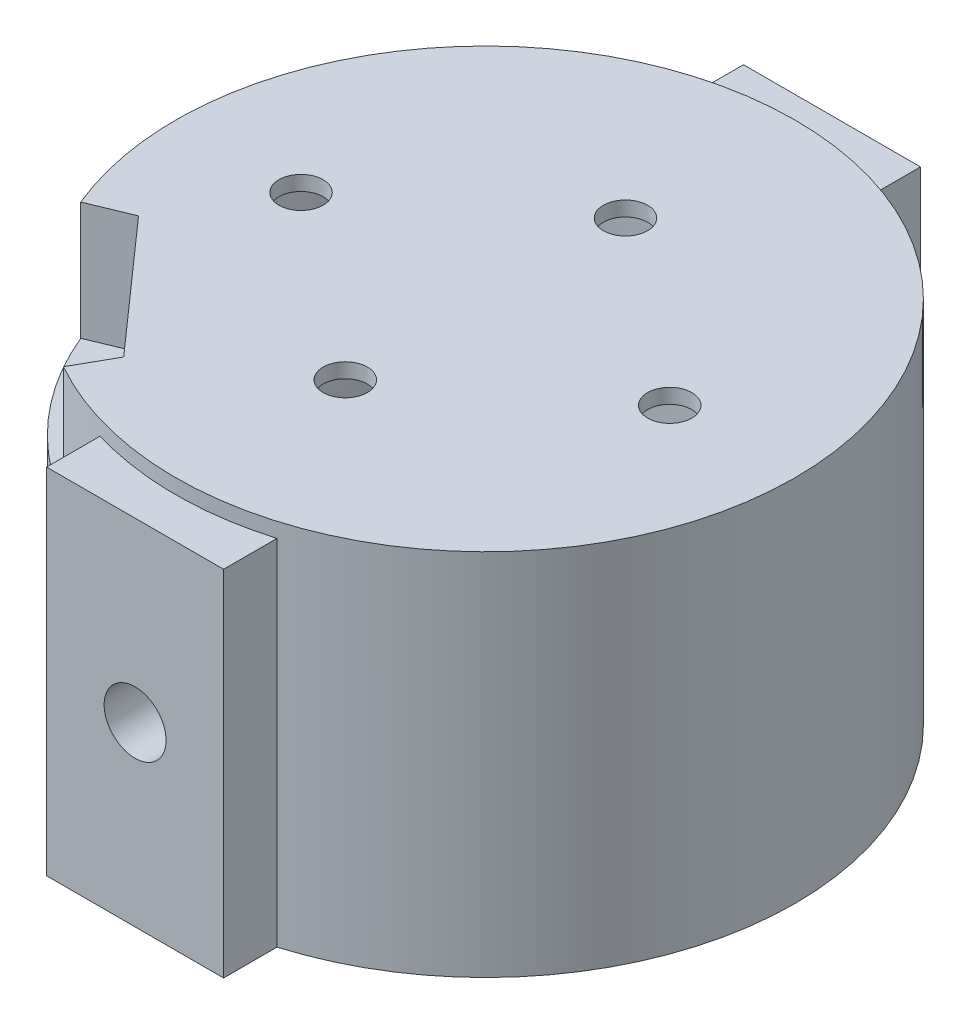
ISO-10303-21;
HEADER;
FILE_DESCRIPTION(('STEP AP214'),'2;1');
FILE_NAME('part.step','',(''),(''),'','','');
FILE_SCHEMA(('AUTOMOTIVE_DESIGN { 1 0 10303 214 1 1 1 1 }'));
ENDSEC;
DATA;
#1=APPLICATION_CONTEXT('core data for automotive mechanical design processes');
#2=APPLICATION_PROTOCOL_DEFINITION('international standard','automotive_design',2000,#1);
#3=PRODUCT_CONTEXT('',#1,'mechanical');
#4=PRODUCT('Part','Part','',(#3));
#5=PRODUCT_RELATED_PRODUCT_CATEGORY('part','',(#4));
#6=PRODUCT_DEFINITION_FORMATION('','',#4);
#7=PRODUCT_DEFINITION_CONTEXT('part definition',#1,'design');
#8=PRODUCT_DEFINITION('design','',#6,#7);
#9=PRODUCT_DEFINITION_SHAPE('','',#8);
#10=(LENGTH_UNIT() NAMED_UNIT(*) SI_UNIT(.MILLI.,.METRE.));
#11=(NAMED_UNIT(*) PLANE_ANGLE_UNIT() SI_UNIT($,.RADIAN.));
#12=(NAMED_UNIT(*) SI_UNIT($,.STERADIAN.) SOLID_ANGLE_UNIT());
#13=UNCERTAINTY_MEASURE_WITH_UNIT(LENGTH_MEASURE(1.E-05),#10,'distance_accuracy_value','');
#14=(GEOMETRIC_REPRESENTATION_CONTEXT(3) GLOBAL_UNCERTAINTY_ASSIGNED_CONTEXT((#13)) GLOBAL_UNIT_ASSIGNED_CONTEXT((#10,
#11,#12)) REPRESENTATION_CONTEXT('',''));
#15=CARTESIAN_POINT('',(0.,0.,0.));
#16=DIRECTION('',(0.,0.,1.));
#17=DIRECTION('',(1.,0.,0.));
#18=AXIS2_PLACEMENT_3D('',#15,#16,#17);
#19=CARTESIAN_POINT('',(0.,12.,0.));
#20=DIRECTION('',(0.,1.,0.));
#21=DIRECTION('',(0.,0.,1.));
#22=AXIS2_PLACEMENT_3D('',#19,#20,#21);
#23=PLANE('',#22);
#24=CARTESIAN_POINT('',(12.5,12.,0.));
#25=DIRECTION('',(0.,1.,0.));
#26=DIRECTION('',(0.,0.,1.));
#27=AXIS2_PLACEMENT_3D('',#24,#25,#26);
#28=CIRCLE('',#27,1.5);
#29=CARTESIAN_POINT('',(12.5,12.,1.5));
#30=VERTEX_POINT('',#29);
#31=EDGE_CURVE('E443',#30,#30,#28,.F.);
#32=ORIENTED_EDGE('',*,*,#31,.F.);
#33=EDGE_LOOP('',(#32));
#34=FACE_BOUND('',#33,.T.);
#35=CARTESIAN_POINT('',(-12.5,12.,0.));
#36=DIRECTION('',(0.,1.,0.));
#37=DIRECTION('',(0.,0.,1.));
#38=AXIS2_PLACEMENT_3D('',#35,#36,#37);
#39=CIRCLE('',#38,1.5);
#40=CARTESIAN_POINT('',(-12.5,12.,1.5));
#41=VERTEX_POINT('',#40);
#42=EDGE_CURVE('E461',#41,#41,#39,.F.);
#43=ORIENTED_EDGE('',*,*,#42,.F.);
#44=EDGE_LOOP('',(#43));
#45=FACE_BOUND('',#44,.T.);
#46=CARTESIAN_POINT('',(0.,12.,9.5));
#47=DIRECTION('',(0.,1.,0.));
#48=DIRECTION('',(0.,0.,1.));
#49=AXIS2_PLACEMENT_3D('',#46,#47,#48);
#50=CIRCLE('',#49,1.5);
#51=CARTESIAN_POINT('',(0.,12.,11.));
#52=VERTEX_POINT('',#51);
#53=EDGE_CURVE('E453',#52,#52,#50,.F.);
#54=ORIENTED_EDGE('',*,*,#53,.F.);
#55=EDGE_LOOP('',(#54));
#56=FACE_BOUND('',#55,.T.);
#57=CARTESIAN_POINT('',(0.,12.,-9.5));
#58=DIRECTION('',(0.,1.,0.));
#59=DIRECTION('',(0.,0.,1.));
#60=AXIS2_PLACEMENT_3D('',#57,#58,#59);
#61=CIRCLE('',#60,1.5);
#62=CARTESIAN_POINT('',(0.,12.,-8.));
#63=VERTEX_POINT('',#62);
#64=EDGE_CURVE('E448',#63,#63,#61,.F.);
#65=ORIENTED_EDGE('',*,*,#64,.F.);
#66=EDGE_LOOP('',(#65));
#67=FACE_BOUND('',#66,.T.);
#68=DIRECTION('',(0.662867909724428,0.,0.748736358311501));
#69=VECTOR('',#68,1.);
#70=CARTESIAN_POINT('',(-12.7403267092854,12.,11.2792088179547));
#71=LINE('',#70,#69);
#72=CARTESIAN_POINT('',(-16.08935317476,12.,7.49634673810121));
#73=VERTEX_POINT('',#72);
#74=CARTESIAN_POINT('',(-9.39130024381087,12.,15.0620708978081));
#75=VERTEX_POINT('',#74);
#76=EDGE_CURVE('E171',#73,#75,#71,.T.);
#77=ORIENTED_EDGE('',*,*,#76,.F.);
#78=CARTESIAN_POINT('',(0.,12.,0.));
#79=DIRECTION('',(0.,1.,0.));
#80=DIRECTION('',(0.,0.,1.));
#81=AXIS2_PLACEMENT_3D('',#78,#79,#80);
#82=CIRCLE('',#81,17.75);
#83=CARTESIAN_POINT('',(-2.9685855217595,12.,-17.5));
#84=VERTEX_POINT('',#83);
#85=EDGE_CURVE('E260',#84,#73,#82,.T.);
#86=ORIENTED_EDGE('',*,*,#85,.F.);
#87=DIRECTION('',(1.,0.,0.));
#88=VECTOR('',#87,1.);
#89=CARTESIAN_POINT('',(-6.,12.,-17.5));
#90=LINE('',#89,#88);
#91=CARTESIAN_POINT('',(2.9685855217595,12.,-17.5));
#92=VERTEX_POINT('',#91);
#93=EDGE_CURVE('E215',#84,#92,#90,.T.);
#94=ORIENTED_EDGE('',*,*,#93,.T.);
#95=EDGE_CURVE('E252',#75,#92,#82,.T.);
#96=ORIENTED_EDGE('',*,*,#95,.F.);
#97=EDGE_LOOP('',(#77,#86,#94,#96));
#98=FACE_BOUND('',#97,.T.);
#99=ADVANCED_FACE('F45',(#34,#45,#56,#67,#98),#23,.F.);
#100=CARTESIAN_POINT('',(0.,13.,0.));
#101=DIRECTION('',(0.,-1.,0.));
#102=DIRECTION('',(0.,0.,-1.));
#103=AXIS2_PLACEMENT_3D('',#100,#101,#102);
#104=CYLINDRICAL_SURFACE('',#103,21.);
#105=CARTESIAN_POINT('',(0.,12.,0.));
#106=DIRECTION('',(0.,1.,0.));
#107=DIRECTION('',(0.,0.,1.));
#108=AXIS2_PLACEMENT_3D('',#105,#106,#107);
#109=CIRCLE('',#108,21.);
#110=CARTESIAN_POINT('',(6.,12.,-20.1246117974981));
#111=VERTEX_POINT('',#110);
#112=CARTESIAN_POINT('',(-6.,12.,-20.1246117974981));
#113=VERTEX_POINT('',#112);
#114=EDGE_CURVE('E190',#111,#113,#109,.T.);
#115=ORIENTED_EDGE('',*,*,#114,.T.);
#116=DIRECTION('',(0.,-1.,0.));
#117=VECTOR('',#116,1.);
#118=CARTESIAN_POINT('',(-6.,12.,-20.1246117974981));
#119=LINE('',#118,#117);
#120=CARTESIAN_POINT('',(-6.,-12.,-20.1246117974981));
#121=VERTEX_POINT('',#120);
#122=EDGE_CURVE('E289',#113,#121,#119,.T.);
#123=ORIENTED_EDGE('',*,*,#122,.T.);
#124=CARTESIAN_POINT('',(0.,-12.,0.));
#125=DIRECTION('',(0.,1.,0.));
#126=DIRECTION('',(0.,0.,1.));
#127=AXIS2_PLACEMENT_3D('',#124,#125,#126);
#128=CIRCLE('',#127,21.);
#129=CARTESIAN_POINT('',(-6.,-12.,20.1246117974981));
#130=VERTEX_POINT('',#129);
#131=EDGE_CURVE('E265',#121,#130,#128,.T.);
#132=ORIENTED_EDGE('',*,*,#131,.T.);
#133=DIRECTION('',(0.,-1.,0.));
#134=VECTOR('',#133,1.);
#135=CARTESIAN_POINT('',(-6.,12.,20.1246117974981));
#136=LINE('',#135,#134);
#137=CARTESIAN_POINT('',(-6.,12.,20.1246117974981));
#138=VERTEX_POINT('',#137);
#139=EDGE_CURVE('E275',#138,#130,#136,.T.);
#140=ORIENTED_EDGE('',*,*,#139,.F.);
#141=CARTESIAN_POINT('',(6.,12.,20.1246117974981));
#142=VERTEX_POINT('',#141);
#143=EDGE_CURVE('E198',#138,#142,#109,.T.);
#144=ORIENTED_EDGE('',*,*,#143,.T.);
#145=DIRECTION('',(0.,-1.,0.));
#146=VECTOR('',#145,1.);
#147=CARTESIAN_POINT('',(6.,12.,20.1246117974981));
#148=LINE('',#147,#146);
#149=CARTESIAN_POINT('',(6.,-12.,20.1246117974981));
#150=VERTEX_POINT('',#149);
#151=EDGE_CURVE('E279',#150,#142,#148,.F.);
#152=ORIENTED_EDGE('',*,*,#151,.F.);
#153=CARTESIAN_POINT('',(6.,-12.,-20.1246117974981));
#154=VERTEX_POINT('',#153);
#155=EDGE_CURVE('E272',#150,#154,#128,.T.);
#156=ORIENTED_EDGE('',*,*,#155,.T.);
#157=DIRECTION('',(0.,-1.,0.));
#158=VECTOR('',#157,1.);
#159=CARTESIAN_POINT('',(6.,12.,-20.1246117974981));
#160=LINE('',#159,#158);
#161=EDGE_CURVE('E201',#154,#111,#160,.F.);
#162=ORIENTED_EDGE('',*,*,#161,.T.);
#163=EDGE_LOOP('',(#115,#123,#132,#140,#144,#152,#156,#162));
#164=FACE_BOUND('',#163,.T.);
#165=DIRECTION('',(0.,-1.,0.));
#166=VECTOR('',#165,1.);
#167=CARTESIAN_POINT('',(-10.3237377867659,13.,18.2871659398088));
#168=LINE('',#167,#166);
#169=CARTESIAN_POINT('',(-10.3237377867659,13.,18.2871659398088));
#170=VERTEX_POINT('',#169);
#171=CARTESIAN_POINT('',(-10.3237377867659,5.,18.2871659398088));
#172=VERTEX_POINT('',#171);
#173=EDGE_CURVE('E159',#170,#172,#168,.T.);
#174=ORIENTED_EDGE('',*,*,#173,.T.);
#175=CARTESIAN_POINT('',(0.,5.,0.));
#176=DIRECTION('',(0.,1.,0.));
#177=DIRECTION('',(0.,0.,1.));
#178=AXIS2_PLACEMENT_3D('',#175,#176,#177);
#179=CIRCLE('',#178,21.);
#180=CARTESIAN_POINT('',(-19.4036912015668,5.,8.03098796875209));
#181=VERTEX_POINT('',#180);
#182=EDGE_CURVE('E428',#181,#172,#179,.T.);
#183=ORIENTED_EDGE('',*,*,#182,.F.);
#184=DIRECTION('',(0.,-1.,0.));
#185=VECTOR('',#184,1.);
#186=CARTESIAN_POINT('',(-19.4036912015668,13.,8.03098796875209));
#187=LINE('',#186,#185);
#188=CARTESIAN_POINT('',(-19.4036912015668,13.,8.03098796875209));
#189=VERTEX_POINT('',#188);
#190=EDGE_CURVE('E187',#189,#181,#187,.T.);
#191=ORIENTED_EDGE('',*,*,#190,.F.);
#192=CARTESIAN_POINT('',(0.,13.,0.));
#193=DIRECTION('',(0.,1.,0.));
#194=DIRECTION('',(0.,0.,1.));
#195=AXIS2_PLACEMENT_3D('',#192,#193,#194);
#196=CIRCLE('',#195,21.);
#197=EDGE_CURVE('E179',#170,#189,#196,.T.);
#198=ORIENTED_EDGE('',*,*,#197,.F.);
#199=EDGE_LOOP('',(#174,#183,#191,#198));
#200=FACE_BOUND('',#199,.T.);
#201=ADVANCED_FACE('F185',(#164,#200),#104,.T.);
#202=CARTESIAN_POINT('',(0.,13.,0.));
#203=DIRECTION('',(0.,1.,0.));
#204=DIRECTION('',(0.,0.,1.));
#205=AXIS2_PLACEMENT_3D('',#202,#203,#204);
#206=PLANE('',#205);
#207=CARTESIAN_POINT('',(0.,13.,-9.5));
#208=DIRECTION('',(0.,1.,0.));
#209=DIRECTION('',(0.,0.,1.));
#210=AXIS2_PLACEMENT_3D('',#207,#208,#209);
#211=CIRCLE('',#210,1.5);
#212=CARTESIAN_POINT('',(0.,13.,-8.));
#213=VERTEX_POINT('',#212);
#214=EDGE_CURVE('E444',#213,#213,#211,.T.);
#215=ORIENTED_EDGE('',*,*,#214,.F.);
#216=EDGE_LOOP('',(#215));
#217=FACE_BOUND('',#216,.T.);
#218=CARTESIAN_POINT('',(0.,13.,9.5));
#219=DIRECTION('',(0.,1.,0.));
#220=DIRECTION('',(0.,0.,1.));
#221=AXIS2_PLACEMENT_3D('',#218,#219,#220);
#222=CIRCLE('',#221,1.5);
#223=CARTESIAN_POINT('',(0.,13.,11.));
#224=VERTEX_POINT('',#223);
#225=EDGE_CURVE('E449',#224,#224,#222,.T.);
#226=ORIENTED_EDGE('',*,*,#225,.F.);
#227=EDGE_LOOP('',(#226));
#228=FACE_BOUND('',#227,.T.);
#229=CARTESIAN_POINT('',(-12.5,13.,0.));
#230=DIRECTION('',(0.,1.,0.));
#231=DIRECTION('',(0.,0.,1.));
#232=AXIS2_PLACEMENT_3D('',#229,#230,#231);
#233=CIRCLE('',#232,1.5);
#234=CARTESIAN_POINT('',(-12.5,13.,1.5));
#235=VERTEX_POINT('',#234);
#236=EDGE_CURVE('E457',#235,#235,#233,.T.);
#237=ORIENTED_EDGE('',*,*,#236,.F.);
#238=EDGE_LOOP('',(#237));
#239=FACE_BOUND('',#238,.T.);
#240=CARTESIAN_POINT('',(12.5,13.,0.));
#241=DIRECTION('',(0.,1.,0.));
#242=DIRECTION('',(0.,0.,1.));
#243=AXIS2_PLACEMENT_3D('',#240,#241,#242);
#244=CIRCLE('',#243,1.5);
#245=CARTESIAN_POINT('',(12.5,13.,1.5));
#246=VERTEX_POINT('',#245);
#247=EDGE_CURVE('E465',#246,#246,#244,.T.);
#248=ORIENTED_EDGE('',*,*,#247,.F.);
#249=EDGE_LOOP('',(#248));
#250=FACE_BOUND('',#249,.T.);
#251=DIRECTION('',(-0.662867909724428,0.,-0.748736358311501));
#252=VECTOR('',#251,1.);
#253=CARTESIAN_POINT('',(-8.84891810294221,13.,15.6747136626932));
#254=LINE('',#253,#252);
#255=CARTESIAN_POINT('',(-8.84891810294221,13.,15.6747136626932));
#256=VERTEX_POINT('',#255);
#257=CARTESIAN_POINT('',(-16.6317353156287,13.,6.88370397321607));
#258=VERTEX_POINT('',#257);
#259=EDGE_CURVE('E180',#256,#258,#254,.T.);
#260=ORIENTED_EDGE('',*,*,#259,.F.);
#261=DIRECTION('',(0.491606561274567,0.,-0.870817425705179));
#262=VECTOR('',#261,1.);
#263=CARTESIAN_POINT('',(-10.3237377867659,13.,18.2871659398088));
#264=LINE('',#263,#262);
#265=EDGE_CURVE('E163',#170,#256,#264,.T.);
#266=ORIENTED_EDGE('',*,*,#265,.F.);
#267=ORIENTED_EDGE('',*,*,#197,.T.);
#268=DIRECTION('',(-0.923985295312703,0.,0.382427998512004));
#269=VECTOR('',#268,1.);
#270=CARTESIAN_POINT('',(-19.4036912015668,13.,8.03098796875209));
#271=LINE('',#270,#269);
#272=EDGE_CURVE('E436',#258,#189,#271,.T.);
#273=ORIENTED_EDGE('',*,*,#272,.F.);
#274=EDGE_LOOP('',(#260,#266,#267,#273));
#275=FACE_BOUND('',#274,.T.);
#276=ADVANCED_FACE('F177',(#217,#228,#239,#250,#275),#206,.T.);
#277=CARTESIAN_POINT('',(0.,12.,0.));
#278=DIRECTION('',(0.,-1.,0.));
#279=DIRECTION('',(0.,0.,-1.));
#280=AXIS2_PLACEMENT_3D('',#277,#278,#279);
#281=CYLINDRICAL_SURFACE('',#280,17.75);
#282=CARTESIAN_POINT('',(-2.1,0.,17.6253368762132));
#283=CARTESIAN_POINT('',(-2.09999497457011,0.117514192864876,17.6253384839931));
#284=CARTESIAN_POINT('',(-2.09010274397484,0.235103065271353,17.626524820879));
#285=CARTESIAN_POINT('',(-2.05079506603811,0.467011863027573,17.6311405220114));
#286=CARTESIAN_POINT('',(-2.02135889541085,0.581328183991729,17.6345722671053));
#287=CARTESIAN_POINT('',(-1.94384016752987,0.803300431820883,17.6432847596922));
#288=CARTESIAN_POINT('',(-1.89576987451454,0.91096068551862,17.6485642908245));
#289=CARTESIAN_POINT('',(-1.78237295939766,1.11666484517722,17.66037601189));
#290=CARTESIAN_POINT('',(-1.71704942477816,1.21471046738401,17.6669079776417));
#291=CARTESIAN_POINT('',(-1.57064819362347,1.39891625415866,17.6805253710103));
#292=CARTESIAN_POINT('',(-1.48950112066302,1.4850211124615,17.6876131505886));
#293=CARTESIAN_POINT('',(-1.31390539278136,1.64242383836488,17.7015223563675));
#294=CARTESIAN_POINT('',(-1.21945609220136,1.71372098681813,17.7083437696189));
#295=CARTESIAN_POINT('',(-1.01959150760068,1.8396810396263,17.720975527284));
#296=CARTESIAN_POINT('',(-0.91414464095647,1.89429416250822,17.7267828241341));
#297=CARTESIAN_POINT('',(-0.695496196065138,1.98501716501783,17.7367062368644));
#298=CARTESIAN_POINT('',(-0.582294877096461,2.02112766295865,17.740822409257));
#299=CARTESIAN_POINT('',(-0.35191500020433,2.07365587403977,17.7468832401839));
#300=CARTESIAN_POINT('',(-0.234757620644101,2.09016528693601,17.7488380074434));
#301=CARTESIAN_POINT('',(0.000680059057752422,2.10330674650208,17.7503902615693));
#302=CARTESIAN_POINT('',(0.1189603192215,2.09993949820986,17.749987832047));
#303=CARTESIAN_POINT('',(0.352662726645481,2.07349698034092,17.7468792408385));
#304=CARTESIAN_POINT('',(0.468096206693698,2.05052032597817,17.7441846068132));
#305=CARTESIAN_POINT('',(0.693457156374694,1.98566522287494,17.7368073999878));
#306=CARTESIAN_POINT('',(0.803384530620642,1.94378644680308,17.7321247927618));
#307=CARTESIAN_POINT('',(1.0149197363725,1.84221007664568,17.7212780018913));
#308=CARTESIAN_POINT('',(1.1165067518047,1.78246952866486,17.7151102538274));
#309=CARTESIAN_POINT('',(1.30825046556167,1.64689665722559,17.7019838173066));
#310=CARTESIAN_POINT('',(1.39840669391728,1.57106367247988,17.6950250963517));
#311=CARTESIAN_POINT('',(1.56530849017899,1.40490555047369,17.6810458098615));
#312=CARTESIAN_POINT('',(1.64196855635121,1.31449451316393,17.6740251265555));
#313=CARTESIAN_POINT('',(1.77903815493047,1.12204259539126,17.6607553750052));
#314=CARTESIAN_POINT('',(1.83944764548604,1.02000168497793,17.6545063087482));
#315=CARTESIAN_POINT('',(1.94230463804829,0.807113436512074,17.6434872557028));
#316=CARTESIAN_POINT('',(1.98474574502029,0.696262979742427,17.6387177956746));
#317=CARTESIAN_POINT('',(2.05038777082995,0.468939796336052,17.6312084522307));
#318=CARTESIAN_POINT('',(2.07358951731786,0.352467311779185,17.6284684815099));
#319=CARTESIAN_POINT('',(2.0999819182446,0.117960131411633,17.6253440986992));
#320=CARTESIAN_POINT('',(2.10329269413139,-6.08643550608154E-05,17.6249455471184));
#321=CARTESIAN_POINT('',(2.0901256896756,-0.234975852704024,17.6265117601527));
#322=CARTESIAN_POINT('',(2.07364828617222,-0.35186986670541,17.6284764797626));
#323=CARTESIAN_POINT('',(2.02147361271803,-0.580855576109418,17.6345349726063));
#324=CARTESIAN_POINT('',(1.98583411214244,-0.692960618244096,17.6386223452657));
#325=CARTESIAN_POINT('',(1.89640624282503,-0.909602898853684,17.6484604166046));
#326=CARTESIAN_POINT('',(1.84261729969191,-1.01413989768891,17.6542111679257));
#327=CARTESIAN_POINT('',(1.71812046655551,-1.21322331222961,17.6667620138539));
#328=CARTESIAN_POINT('',(1.64733356439967,-1.3077200072427,17.6735669546492));
#329=CARTESIAN_POINT('',(1.49096233343904,-1.48353398651556,17.6874440442682));
#330=CARTESIAN_POINT('',(1.40537749003037,-1.5648508122499,17.6945162023777));
#331=CARTESIAN_POINT('',(1.22131611691068,-1.71241650126632,17.7081741014343));
#332=CARTESIAN_POINT('',(1.12277621182241,-1.77858659619061,17.714757184498));
#333=CARTESIAN_POINT('',(0.91591148730797,-1.89343634293221,17.7266557736579));
#334=CARTESIAN_POINT('',(0.807586847377206,-1.94211631551436,17.7319713030001));
#335=CARTESIAN_POINT('',(0.584493138646726,-2.02047291355435,17.7407240194323));
#336=CARTESIAN_POINT('',(0.469740452054107,-2.05019565201694,17.744165761452));
#337=CARTESIAN_POINT('',(0.236830010389771,-2.08994422263726,17.7488019671408));
#338=CARTESIAN_POINT('',(0.118672392272623,-2.09997084590138,17.7499965210696));
#339=CARTESIAN_POINT('',(-0.116923445332441,-2.10002885078966,17.7500034428646));
#340=CARTESIAN_POINT('',(-0.234361653133972,-2.09018192305285,17.7488303086673));
#341=CARTESIAN_POINT('',(-0.465902057714125,-2.05102934121164,17.7442624099992));
#342=CARTESIAN_POINT('',(-0.580004255200978,-2.02172369123833,17.7408676460002));
#343=CARTESIAN_POINT('',(-0.801622006634241,-1.94452250298778,17.7322363747574));
#344=CARTESIAN_POINT('',(-0.909139389739768,-1.89663215461853,17.7270003817281));
#345=CARTESIAN_POINT('',(-1.11463030831669,-1.78363362508303,17.715267551002));
#346=CARTESIAN_POINT('',(-1.21260377853464,-1.71852532620589,17.7087707046854));
#347=CARTESIAN_POINT('',(-1.39684823984954,-1.57248677360728,17.6951946188659));
#348=CARTESIAN_POINT('',(-1.48304715921969,-1.49146588573206,17.6881121844851));
#349=CARTESIAN_POINT('',(-1.64067464262965,-1.3160885847277,17.6741892411012));
#350=CARTESIAN_POINT('',(-1.71209969164048,-1.22172900699965,17.6673487899915));
#351=CARTESIAN_POINT('',(-1.83836011591057,-1.02198116940104,17.6546590138458));
#352=CARTESIAN_POINT('',(-1.89313708388408,-0.916555787655926,17.6488132092334));
#353=CARTESIAN_POINT('',(-1.98413329452311,-0.6979950670488,17.6388159897414));
#354=CARTESIAN_POINT('',(-2.02037293807799,-0.584868359824667,17.6346627132114));
#355=CARTESIAN_POINT('',(-2.06448458184778,-0.392616301777694,17.6295405976475));
#356=CARTESIAN_POINT('',(-2.07778399037303,-0.314708722466666,17.6279719370203));
#357=CARTESIAN_POINT('',(-2.09554335889179,-0.157878661918286,17.6258695395543));
#358=CARTESIAN_POINT('',(-2.10000337651797,-0.0789561873014105,17.6253357959677));
#359=CARTESIAN_POINT('',(-2.1,0.,17.6253368762132));
#360=B_SPLINE_CURVE_WITH_KNOTS('',3,(#282,#283,#284,#285,#286,#287,#288,#289,#290,#291,#292,
#293,#294,#295,#296,#297,#298,#299,#300,#301,#302,#303,#304,#305,#306,#307,#308,#309,#310,#311,
#312,#313,#314,#315,#316,#317,#318,#319,#320,#321,#322,#323,#324,#325,#326,#327,#328,#329,#330,
#331,#332,#333,#334,#335,#336,#337,#338,#339,#340,#341,#342,#343,#344,#345,#346,#347,#348,#349,
#350,#351,#352,#353,#354,#355,#356,#357,#358,#359),.UNSPECIFIED.,.T.,.F.,(4,2,2,2,2,2,2,2,2,2,2,
2,2,2,2,2,2,2,2,2,2,2,2,2,2,2,2,2,2,2,2,2,2,2,2,2,2,2,4),(0.,0.352254170456825,
0.704882449048816,1.05727903470183,1.40961260136707,1.76352715077893,2.11745888429311,
2.47243658388663,2.82740242020732,3.1807009928412,3.53398703382298,3.88550680697697,
4.23703266769437,4.58941076979217,4.94180335498524,5.29635383908705,5.65090523628376,
6.00558271417644,6.36024493355075,6.7127631796286,7.06527471257817,7.41672941382375,
7.76819523890742,8.12132754432937,8.47447213252874,8.8294134638659,9.18434828532795,
9.53841641028742,9.89247031359542,10.2443628355637,10.596255282825,10.9480495322737,
11.2998461868338,11.6537079510467,12.0076538101671,12.3628274697946,12.717609404459,
12.9542857319903,13.1909605163908),.UNSPECIFIED.);
#361=CARTESIAN_POINT('',(-2.1,0.,17.6253368762132));
#362=VERTEX_POINT('',#361);
#363=EDGE_CURVE('E324',#362,#362,#360,.T.);
#364=ORIENTED_EDGE('',*,*,#363,.F.);
#365=EDGE_LOOP('',(#364));
#366=FACE_BOUND('',#365,.T.);
#367=ORIENTED_EDGE('',*,*,#85,.T.);
#368=DIRECTION('',(0.,-1.,0.));
#369=VECTOR('',#368,1.);
#370=CARTESIAN_POINT('',(-16.08935317476,12.,7.49634673810119));
#371=LINE('',#370,#369);
#372=CARTESIAN_POINT('',(-16.08935317476,5.,7.49634673810121));
#373=VERTEX_POINT('',#372);
#374=EDGE_CURVE('E11',#73,#373,#371,.T.);
#375=ORIENTED_EDGE('',*,*,#374,.T.);
#376=CARTESIAN_POINT('',(0.,5.,0.));
#377=DIRECTION('',(0.,1.,0.));
#378=DIRECTION('',(0.,0.,1.));
#379=AXIS2_PLACEMENT_3D('',#376,#377,#378);
#380=CIRCLE('',#379,17.75);
#381=CARTESIAN_POINT('',(-9.39130024381089,5.,15.0620708978081));
#382=VERTEX_POINT('',#381);
#383=EDGE_CURVE('E240',#373,#382,#380,.T.);
#384=ORIENTED_EDGE('',*,*,#383,.T.);
#385=DIRECTION('',(0.,-1.,0.));
#386=VECTOR('',#385,1.);
#387=CARTESIAN_POINT('',(-9.39130024381087,12.,15.0620708978081));
#388=LINE('',#387,#386);
#389=EDGE_CURVE('E54',#382,#75,#388,.F.);
#390=ORIENTED_EDGE('',*,*,#389,.T.);
#391=ORIENTED_EDGE('',*,*,#95,.T.);
#392=DIRECTION('',(0.,-1.,0.));
#393=VECTOR('',#392,1.);
#394=CARTESIAN_POINT('',(2.9685855217595,12.,-17.5));
#395=LINE('',#394,#393);
#396=CARTESIAN_POINT('',(2.9685855217595,-12.,-17.5));
#397=VERTEX_POINT('',#396);
#398=EDGE_CURVE('E287',#397,#92,#395,.F.);
#399=ORIENTED_EDGE('',*,*,#398,.F.);
#400=CARTESIAN_POINT('',(0.,-12.,0.));
#401=DIRECTION('',(0.,1.,0.));
#402=DIRECTION('',(0.,0.,1.));
#403=AXIS2_PLACEMENT_3D('',#400,#401,#402);
#404=CIRCLE('',#403,17.75);
#405=CARTESIAN_POINT('',(-2.9685855217595,-12.,-17.5));
#406=VERTEX_POINT('',#405);
#407=EDGE_CURVE('E261',#406,#397,#404,.T.);
#408=ORIENTED_EDGE('',*,*,#407,.F.);
#409=DIRECTION('',(0.,-1.,0.));
#410=VECTOR('',#409,1.);
#411=CARTESIAN_POINT('',(-2.9685855217595,12.,-17.5));
#412=LINE('',#411,#410);
#413=EDGE_CURVE('E283',#84,#406,#412,.T.);
#414=ORIENTED_EDGE('',*,*,#413,.F.);
#415=EDGE_LOOP('',(#367,#375,#384,#390,#391,#399,#408,#414));
#416=FACE_BOUND('',#415,.T.);
#417=ADVANCED_FACE('F251',(#366,#416),#281,.F.);
#418=CARTESIAN_POINT('',(6.,12.,-17.5));
#419=DIRECTION('',(-1.,0.,0.));
#420=DIRECTION('',(0.,0.,1.));
#421=AXIS2_PLACEMENT_3D('',#418,#419,#420);
#422=PLANE('',#421);
#423=ORIENTED_EDGE('',*,*,#161,.F.);
#424=DIRECTION('',(0.,0.,-1.));
#425=VECTOR('',#424,1.);
#426=CARTESIAN_POINT('',(6.,-12.,-17.5));
#427=LINE('',#426,#425);
#428=CARTESIAN_POINT('',(6.,-12.,-23.5));
#429=VERTEX_POINT('',#428);
#430=EDGE_CURVE('E220',#154,#429,#427,.T.);
#431=ORIENTED_EDGE('',*,*,#430,.T.);
#432=DIRECTION('',(0.,-1.,0.));
#433=VECTOR('',#432,1.);
#434=CARTESIAN_POINT('',(6.,12.,-23.5));
#435=LINE('',#434,#433);
#436=CARTESIAN_POINT('',(6.,12.,-23.5));
#437=VERTEX_POINT('',#436);
#438=EDGE_CURVE('E236',#437,#429,#435,.T.);
#439=ORIENTED_EDGE('',*,*,#438,.F.);
#440=DIRECTION('',(0.,0.,-1.));
#441=VECTOR('',#440,1.);
#442=CARTESIAN_POINT('',(6.,12.,-17.5));
#443=LINE('',#442,#441);
#444=EDGE_CURVE('E204',#111,#437,#443,.T.);
#445=ORIENTED_EDGE('',*,*,#444,.F.);
#446=EDGE_LOOP('',(#423,#431,#439,#445));
#447=FACE_BOUND('',#446,.T.);
#448=ADVANCED_FACE('F47',(#447),#422,.F.);
#449=CARTESIAN_POINT('',(-6.,12.,-17.5));
#450=DIRECTION('',(1.,0.,0.));
#451=DIRECTION('',(0.,0.,-1.));
#452=AXIS2_PLACEMENT_3D('',#449,#450,#451);
#453=PLANE('',#452);
#454=ORIENTED_EDGE('',*,*,#122,.F.);
#455=DIRECTION('',(0.,0.,1.));
#456=VECTOR('',#455,1.);
#457=CARTESIAN_POINT('',(-6.,12.,-17.5));
#458=LINE('',#457,#456);
#459=CARTESIAN_POINT('',(-6.,12.,-23.5));
#460=VERTEX_POINT('',#459);
#461=EDGE_CURVE('E211',#460,#113,#458,.T.);
#462=ORIENTED_EDGE('',*,*,#461,.F.);
#463=DIRECTION('',(0.,-1.,0.));
#464=VECTOR('',#463,1.);
#465=CARTESIAN_POINT('',(-6.,12.,-23.5));
#466=LINE('',#465,#464);
#467=CARTESIAN_POINT('',(-6.,-12.,-23.5));
#468=VERTEX_POINT('',#467);
#469=EDGE_CURVE('E219',#460,#468,#466,.T.);
#470=ORIENTED_EDGE('',*,*,#469,.T.);
#471=DIRECTION('',(0.,0.,1.));
#472=VECTOR('',#471,1.);
#473=CARTESIAN_POINT('',(-6.,-12.,-17.5));
#474=LINE('',#473,#472);
#475=EDGE_CURVE('E226',#468,#121,#474,.T.);
#476=ORIENTED_EDGE('',*,*,#475,.T.);
#477=EDGE_LOOP('',(#454,#462,#470,#476));
#478=FACE_BOUND('',#477,.T.);
#479=ADVANCED_FACE('F398',(#478),#453,.F.);
#480=CARTESIAN_POINT('',(-6.,12.,-23.5));
#481=DIRECTION('',(0.,0.,1.));
#482=DIRECTION('',(1.,0.,0.));
#483=AXIS2_PLACEMENT_3D('',#480,#481,#482);
#484=PLANE('',#483);
#485=CARTESIAN_POINT('',(0.,0.,-23.5));
#486=DIRECTION('',(0.,0.,-1.));
#487=DIRECTION('',(-1.,0.,0.));
#488=AXIS2_PLACEMENT_3D('',#485,#486,#487);
#489=CIRCLE('',#488,2.1);
#490=CARTESIAN_POINT('',(-2.1,0.,-23.5));
#491=VERTEX_POINT('',#490);
#492=EDGE_CURVE('E189',#491,#491,#489,.T.);
#493=ORIENTED_EDGE('',*,*,#492,.F.);
#494=EDGE_LOOP('',(#493));
#495=FACE_BOUND('',#494,.T.);
#496=DIRECTION('',(-1.,0.,0.));
#497=VECTOR('',#496,1.);
#498=CARTESIAN_POINT('',(-6.,-12.,-23.5));
#499=LINE('',#498,#497);
#500=EDGE_CURVE('E223',#429,#468,#499,.T.);
#501=ORIENTED_EDGE('',*,*,#500,.T.);
#502=ORIENTED_EDGE('',*,*,#469,.F.);
#503=DIRECTION('',(-1.,0.,0.));
#504=VECTOR('',#503,1.);
#505=CARTESIAN_POINT('',(-6.,12.,-23.5));
#506=LINE('',#505,#504);
#507=EDGE_CURVE('E207',#437,#460,#506,.T.);
#508=ORIENTED_EDGE('',*,*,#507,.F.);
#509=ORIENTED_EDGE('',*,*,#438,.T.);
#510=EDGE_LOOP('',(#501,#502,#508,#509));
#511=FACE_BOUND('',#510,.T.);
#512=ADVANCED_FACE('F396',(#495,#511),#484,.F.);
#513=CARTESIAN_POINT('',(-6.,12.,-17.5));
#514=DIRECTION('',(0.,0.,-1.));
#515=DIRECTION('',(-1.,0.,0.));
#516=AXIS2_PLACEMENT_3D('',#513,#514,#515);
#517=PLANE('',#516);
#518=CARTESIAN_POINT('',(0.,0.,-17.5));
#519=DIRECTION('',(0.,0.,-1.));
#520=DIRECTION('',(-1.,0.,0.));
#521=AXIS2_PLACEMENT_3D('',#518,#519,#520);
#522=CIRCLE('',#521,2.1);
#523=CARTESIAN_POINT('',(-2.1,0.,-17.5));
#524=VERTEX_POINT('',#523);
#525=EDGE_CURVE('E195',#524,#524,#522,.T.);
#526=ORIENTED_EDGE('',*,*,#525,.T.);
#527=EDGE_LOOP('',(#526));
#528=FACE_BOUND('',#527,.T.);
#529=DIRECTION('',(1.,0.,0.));
#530=VECTOR('',#529,1.);
#531=CARTESIAN_POINT('',(-6.,-12.,-17.5));
#532=LINE('',#531,#530);
#533=EDGE_CURVE('E208',#406,#397,#532,.T.);
#534=ORIENTED_EDGE('',*,*,#533,.T.);
#535=ORIENTED_EDGE('',*,*,#398,.T.);
#536=ORIENTED_EDGE('',*,*,#93,.F.);
#537=ORIENTED_EDGE('',*,*,#413,.T.);
#538=EDGE_LOOP('',(#534,#535,#536,#537));
#539=FACE_BOUND('',#538,.T.);
#540=ADVANCED_FACE('F390',(#528,#539),#517,.F.);
#541=CARTESIAN_POINT('',(0.,12.,0.));
#542=DIRECTION('',(0.,-1.,0.));
#543=DIRECTION('',(0.,0.,-1.));
#544=AXIS2_PLACEMENT_3D('',#541,#542,#543);
#545=PLANE('',#544);
#546=ORIENTED_EDGE('',*,*,#114,.F.);
#547=ORIENTED_EDGE('',*,*,#444,.T.);
#548=ORIENTED_EDGE('',*,*,#507,.T.);
#549=ORIENTED_EDGE('',*,*,#461,.T.);
#550=EDGE_LOOP('',(#546,#547,#548,#549));
#551=FACE_BOUND('',#550,.T.);
#552=ADVANCED_FACE('F387',(#551),#545,.F.);
#553=CARTESIAN_POINT('',(0.,-12.,0.));
#554=DIRECTION('',(0.,-1.,0.));
#555=DIRECTION('',(0.,0.,-1.));
#556=AXIS2_PLACEMENT_3D('',#553,#554,#555);
#557=PLANE('',#556);
#558=ORIENTED_EDGE('',*,*,#430,.F.);
#559=ORIENTED_EDGE('',*,*,#155,.F.);
#560=DIRECTION('',(0.,0.,-1.));
#561=VECTOR('',#560,1.);
#562=CARTESIAN_POINT('',(6.,-12.,17.75));
#563=LINE('',#562,#561);
#564=CARTESIAN_POINT('',(6.,-12.,23.75));
#565=VERTEX_POINT('',#564);
#566=EDGE_CURVE('E318',#565,#150,#563,.T.);
#567=ORIENTED_EDGE('',*,*,#566,.F.);
#568=DIRECTION('',(1.,0.,0.));
#569=VECTOR('',#568,1.);
#570=CARTESIAN_POINT('',(-6.,-12.,23.75));
#571=LINE('',#570,#569);
#572=CARTESIAN_POINT('',(-6.,-12.,23.75));
#573=VERTEX_POINT('',#572);
#574=EDGE_CURVE('E314',#573,#565,#571,.T.);
#575=ORIENTED_EDGE('',*,*,#574,.F.);
#576=DIRECTION('',(0.,0.,1.));
#577=VECTOR('',#576,1.);
#578=CARTESIAN_POINT('',(-6.,-12.,17.75));
#579=LINE('',#578,#577);
#580=EDGE_CURVE('E323',#130,#573,#579,.T.);
#581=ORIENTED_EDGE('',*,*,#580,.F.);
#582=ORIENTED_EDGE('',*,*,#131,.F.);
#583=ORIENTED_EDGE('',*,*,#475,.F.);
#584=ORIENTED_EDGE('',*,*,#500,.F.);
#585=EDGE_LOOP('',(#558,#559,#567,#575,#581,#582,#583,#584));
#586=FACE_BOUND('',#585,.T.);
#587=ORIENTED_EDGE('',*,*,#533,.F.);
#588=ORIENTED_EDGE('',*,*,#407,.T.);
#589=EDGE_LOOP('',(#587,#588));
#590=FACE_BOUND('',#589,.T.);
#591=ADVANCED_FACE('F385',(#586,#590),#557,.T.);
#592=CARTESIAN_POINT('',(0.,0.,23.75));
#593=DIRECTION('',(0.,0.,-1.));
#594=DIRECTION('',(-1.,0.,0.));
#595=AXIS2_PLACEMENT_3D('',#592,#593,#594);
#596=CYLINDRICAL_SURFACE('',#595,2.1);
#597=ORIENTED_EDGE('',*,*,#525,.F.);
#598=EDGE_LOOP('',(#597));
#599=FACE_BOUND('',#598,.T.);
#600=ORIENTED_EDGE('',*,*,#492,.T.);
#601=EDGE_LOOP('',(#600));
#602=FACE_BOUND('',#601,.T.);
#603=ADVANCED_FACE('F370',(#599,#602),#596,.F.);
#604=CARTESIAN_POINT('',(0.,12.,0.));
#605=DIRECTION('',(0.,1.,0.));
#606=DIRECTION('',(0.,0.,1.));
#607=AXIS2_PLACEMENT_3D('',#604,#605,#606);
#608=PLANE('',#607);
#609=ORIENTED_EDGE('',*,*,#143,.F.);
#610=DIRECTION('',(0.,0.,1.));
#611=VECTOR('',#610,1.);
#612=CARTESIAN_POINT('',(-6.,12.,17.75));
#613=LINE('',#612,#611);
#614=CARTESIAN_POINT('',(-6.,12.,23.75));
#615=VERTEX_POINT('',#614);
#616=EDGE_CURVE('E304',#138,#615,#613,.T.);
#617=ORIENTED_EDGE('',*,*,#616,.T.);
#618=DIRECTION('',(1.,0.,0.));
#619=VECTOR('',#618,1.);
#620=CARTESIAN_POINT('',(-6.,12.,23.75));
#621=LINE('',#620,#619);
#622=CARTESIAN_POINT('',(6.,12.,23.75));
#623=VERTEX_POINT('',#622);
#624=EDGE_CURVE('E309',#615,#623,#621,.T.);
#625=ORIENTED_EDGE('',*,*,#624,.T.);
#626=DIRECTION('',(0.,0.,-1.));
#627=VECTOR('',#626,1.);
#628=CARTESIAN_POINT('',(6.,12.,17.75));
#629=LINE('',#628,#627);
#630=EDGE_CURVE('E307',#623,#142,#629,.T.);
#631=ORIENTED_EDGE('',*,*,#630,.T.);
#632=EDGE_LOOP('',(#609,#617,#625,#631));
#633=FACE_BOUND('',#632,.T.);
#634=ADVANCED_FACE('F303',(#633),#608,.T.);
#635=CARTESIAN_POINT('',(6.,12.,17.75));
#636=DIRECTION('',(-1.,0.,0.));
#637=DIRECTION('',(0.,0.,1.));
#638=AXIS2_PLACEMENT_3D('',#635,#636,#637);
#639=PLANE('',#638);
#640=ORIENTED_EDGE('',*,*,#566,.T.);
#641=ORIENTED_EDGE('',*,*,#151,.T.);
#642=ORIENTED_EDGE('',*,*,#630,.F.);
#643=DIRECTION('',(0.,-1.,0.));
#644=VECTOR('',#643,1.);
#645=CARTESIAN_POINT('',(6.,12.,23.75));
#646=LINE('',#645,#644);
#647=EDGE_CURVE('E319',#623,#565,#646,.T.);
#648=ORIENTED_EDGE('',*,*,#647,.T.);
#649=EDGE_LOOP('',(#640,#641,#642,#648));
#650=FACE_BOUND('',#649,.T.);
#651=ADVANCED_FACE('F316',(#650),#639,.F.);
#652=CARTESIAN_POINT('',(-6.,12.,17.75));
#653=DIRECTION('',(1.,0.,0.));
#654=DIRECTION('',(0.,0.,-1.));
#655=AXIS2_PLACEMENT_3D('',#652,#653,#654);
#656=PLANE('',#655);
#657=ORIENTED_EDGE('',*,*,#616,.F.);
#658=ORIENTED_EDGE('',*,*,#139,.T.);
#659=ORIENTED_EDGE('',*,*,#580,.T.);
#660=DIRECTION('',(0.,-1.,0.));
#661=VECTOR('',#660,1.);
#662=CARTESIAN_POINT('',(-6.,12.,23.75));
#663=LINE('',#662,#661);
#664=EDGE_CURVE('E267',#615,#573,#663,.T.);
#665=ORIENTED_EDGE('',*,*,#664,.F.);
#666=EDGE_LOOP('',(#657,#658,#659,#665));
#667=FACE_BOUND('',#666,.T.);
#668=ADVANCED_FACE('F362',(#667),#656,.F.);
#669=CARTESIAN_POINT('',(-6.,12.,23.75));
#670=DIRECTION('',(0.,0.,-1.));
#671=DIRECTION('',(-1.,0.,0.));
#672=AXIS2_PLACEMENT_3D('',#669,#670,#671);
#673=PLANE('',#672);
#674=CARTESIAN_POINT('',(0.,0.,23.75));
#675=DIRECTION('',(0.,0.,-1.));
#676=DIRECTION('',(-1.,0.,0.));
#677=AXIS2_PLACEMENT_3D('',#674,#675,#676);
#678=CIRCLE('',#677,2.1);
#679=CARTESIAN_POINT('',(-2.1,0.,23.75));
#680=VERTEX_POINT('',#679);
#681=EDGE_CURVE('E330',#680,#680,#678,.T.);
#682=ORIENTED_EDGE('',*,*,#681,.T.);
#683=EDGE_LOOP('',(#682));
#684=FACE_BOUND('',#683,.T.);
#685=ORIENTED_EDGE('',*,*,#574,.T.);
#686=ORIENTED_EDGE('',*,*,#647,.F.);
#687=ORIENTED_EDGE('',*,*,#624,.F.);
#688=ORIENTED_EDGE('',*,*,#664,.T.);
#689=EDGE_LOOP('',(#685,#686,#687,#688));
#690=FACE_BOUND('',#689,.T.);
#691=ADVANCED_FACE('F357',(#684,#690),#673,.F.);
#692=CARTESIAN_POINT('',(0.,0.,23.75));
#693=DIRECTION('',(0.,0.,-1.));
#694=DIRECTION('',(-1.,0.,0.));
#695=AXIS2_PLACEMENT_3D('',#692,#693,#694);
#696=CYLINDRICAL_SURFACE('',#695,2.1);
#697=ORIENTED_EDGE('',*,*,#363,.T.);
#698=EDGE_LOOP('',(#697));
#699=FACE_BOUND('',#698,.T.);
#700=ORIENTED_EDGE('',*,*,#681,.F.);
#701=EDGE_LOOP('',(#700));
#702=FACE_BOUND('',#701,.T.);
#703=ADVANCED_FACE('F351',(#699,#702),#696,.F.);
#704=CARTESIAN_POINT('',(12.5,-12.001,0.));
#705=DIRECTION('',(0.,1.,0.));
#706=DIRECTION('',(0.,0.,1.));
#707=AXIS2_PLACEMENT_3D('',#704,#705,#706);
#708=CYLINDRICAL_SURFACE('',#707,1.5);
#709=ORIENTED_EDGE('',*,*,#247,.T.);
#710=EDGE_LOOP('',(#709));
#711=FACE_BOUND('',#710,.T.);
#712=ORIENTED_EDGE('',*,*,#31,.T.);
#713=EDGE_LOOP('',(#712));
#714=FACE_BOUND('',#713,.T.);
#715=ADVANCED_FACE('F356',(#711,#714),#708,.F.);
#716=CARTESIAN_POINT('',(-12.5,-12.001,0.));
#717=DIRECTION('',(0.,1.,0.));
#718=DIRECTION('',(0.,0.,1.));
#719=AXIS2_PLACEMENT_3D('',#716,#717,#718);
#720=CYLINDRICAL_SURFACE('',#719,1.5);
#721=ORIENTED_EDGE('',*,*,#236,.T.);
#722=EDGE_LOOP('',(#721));
#723=FACE_BOUND('',#722,.T.);
#724=ORIENTED_EDGE('',*,*,#42,.T.);
#725=EDGE_LOOP('',(#724));
#726=FACE_BOUND('',#725,.T.);
#727=ADVANCED_FACE('F489',(#723,#726),#720,.F.);
#728=CARTESIAN_POINT('',(0.,-12.001,9.5));
#729=DIRECTION('',(0.,1.,0.));
#730=DIRECTION('',(0.,0.,1.));
#731=AXIS2_PLACEMENT_3D('',#728,#729,#730);
#732=CYLINDRICAL_SURFACE('',#731,1.5);
#733=ORIENTED_EDGE('',*,*,#225,.T.);
#734=EDGE_LOOP('',(#733));
#735=FACE_BOUND('',#734,.T.);
#736=ORIENTED_EDGE('',*,*,#53,.T.);
#737=EDGE_LOOP('',(#736));
#738=FACE_BOUND('',#737,.T.);
#739=ADVANCED_FACE('F492',(#735,#738),#732,.F.);
#740=CARTESIAN_POINT('',(0.,-12.001,-9.5));
#741=DIRECTION('',(0.,1.,0.));
#742=DIRECTION('',(0.,0.,1.));
#743=AXIS2_PLACEMENT_3D('',#740,#741,#742);
#744=CYLINDRICAL_SURFACE('',#743,1.5);
#745=ORIENTED_EDGE('',*,*,#214,.T.);
#746=EDGE_LOOP('',(#745));
#747=FACE_BOUND('',#746,.T.);
#748=ORIENTED_EDGE('',*,*,#64,.T.);
#749=EDGE_LOOP('',(#748));
#750=FACE_BOUND('',#749,.T.);
#751=ADVANCED_FACE('F499',(#747,#750),#744,.F.);
#752=CARTESIAN_POINT('',(-10.3237377867659,13.,18.2871659398088));
#753=DIRECTION('',(-0.870817425705179,0.,-0.491606561274567));
#754=DIRECTION('',(-0.491606561274567,0.,0.870817425705179));
#755=AXIS2_PLACEMENT_3D('',#752,#753,#754);
#756=PLANE('',#755);
#757=DIRECTION('',(0.491606561274567,0.,-0.870817425705179));
#758=VECTOR('',#757,1.);
#759=CARTESIAN_POINT('',(-10.3237377867659,5.,18.2871659398088));
#760=LINE('',#759,#758);
#761=CARTESIAN_POINT('',(-8.84891810294221,5.,15.6747136626932));
#762=VERTEX_POINT('',#761);
#763=EDGE_CURVE('E165',#172,#762,#760,.T.);
#764=ORIENTED_EDGE('',*,*,#763,.F.);
#765=ORIENTED_EDGE('',*,*,#173,.F.);
#766=ORIENTED_EDGE('',*,*,#265,.T.);
#767=DIRECTION('',(0.,-1.,0.));
#768=VECTOR('',#767,1.);
#769=CARTESIAN_POINT('',(-8.84891810294221,13.,15.6747136626932));
#770=LINE('',#769,#768);
#771=EDGE_CURVE('E172',#256,#762,#770,.T.);
#772=ORIENTED_EDGE('',*,*,#771,.T.);
#773=EDGE_LOOP('',(#764,#765,#766,#772));
#774=FACE_BOUND('',#773,.T.);
#775=ADVANCED_FACE('F161',(#774),#756,.T.);
#776=CARTESIAN_POINT('',(-8.84891810294221,13.,15.6747136626932));
#777=DIRECTION('',(-0.748736358311501,0.,0.662867909724428));
#778=DIRECTION('',(0.662867909724428,0.,0.748736358311501));
#779=AXIS2_PLACEMENT_3D('',#776,#777,#778);
#780=PLANE('',#779);
#781=ORIENTED_EDGE('',*,*,#76,.T.);
#782=ORIENTED_EDGE('',*,*,#389,.F.);
#783=DIRECTION('',(-0.662867909724428,0.,-0.748736358311501));
#784=VECTOR('',#783,1.);
#785=CARTESIAN_POINT('',(-8.84891810294221,5.,15.6747136626932));
#786=LINE('',#785,#784);
#787=EDGE_CURVE('E69',#762,#382,#786,.T.);
#788=ORIENTED_EDGE('',*,*,#787,.F.);
#789=ORIENTED_EDGE('',*,*,#771,.F.);
#790=ORIENTED_EDGE('',*,*,#259,.T.);
#791=DIRECTION('',(0.,-1.,0.));
#792=VECTOR('',#791,1.);
#793=CARTESIAN_POINT('',(-16.6317353156287,13.,6.88370397321608));
#794=LINE('',#793,#792);
#795=CARTESIAN_POINT('',(-16.6317353156287,5.,6.88370397321608));
#796=VERTEX_POINT('',#795);
#797=EDGE_CURVE('E61',#258,#796,#794,.T.);
#798=ORIENTED_EDGE('',*,*,#797,.T.);
#799=EDGE_CURVE('E423',#373,#796,#786,.T.);
#800=ORIENTED_EDGE('',*,*,#799,.F.);
#801=ORIENTED_EDGE('',*,*,#374,.F.);
#802=EDGE_LOOP('',(#781,#782,#788,#789,#790,#798,#800,#801));
#803=FACE_BOUND('',#802,.T.);
#804=ADVANCED_FACE('F422',(#803),#780,.T.);
#805=CARTESIAN_POINT('',(-19.4036912015668,13.,8.03098796875209));
#806=DIRECTION('',(0.382427998512004,0.,0.923985295312703));
#807=DIRECTION('',(0.923985295312703,0.,-0.382427998512004));
#808=AXIS2_PLACEMENT_3D('',#805,#806,#807);
#809=PLANE('',#808);
#810=DIRECTION('',(-0.923985295312703,0.,0.382427998512004));
#811=VECTOR('',#810,1.);
#812=CARTESIAN_POINT('',(-19.4036912015668,5.,8.03098796875209));
#813=LINE('',#812,#811);
#814=EDGE_CURVE('E182',#796,#181,#813,.T.);
#815=ORIENTED_EDGE('',*,*,#814,.F.);
#816=ORIENTED_EDGE('',*,*,#797,.F.);
#817=ORIENTED_EDGE('',*,*,#272,.T.);
#818=ORIENTED_EDGE('',*,*,#190,.T.);
#819=EDGE_LOOP('',(#815,#816,#817,#818));
#820=FACE_BOUND('',#819,.T.);
#821=ADVANCED_FACE('F512',(#820),#809,.T.);
#822=CARTESIAN_POINT('',(0.,5.,0.));
#823=DIRECTION('',(0.,1.,0.));
#824=DIRECTION('',(0.,0.,1.));
#825=AXIS2_PLACEMENT_3D('',#822,#823,#824);
#826=PLANE('',#825);
#827=ORIENTED_EDGE('',*,*,#799,.T.);
#828=ORIENTED_EDGE('',*,*,#814,.T.);
#829=ORIENTED_EDGE('',*,*,#182,.T.);
#830=ORIENTED_EDGE('',*,*,#763,.T.);
#831=ORIENTED_EDGE('',*,*,#787,.T.);
#832=ORIENTED_EDGE('',*,*,#383,.F.);
#833=EDGE_LOOP('',(#827,#828,#829,#830,#831,#832));
#834=FACE_BOUND('',#833,.T.);
#835=ADVANCED_FACE('F515',(#834),#826,.T.);
#836=CLOSED_SHELL('',(#99,#201,#276,#417,#448,#479,#512,#540,#552,#591,#603,#634,#651,#668,#691,
#703,#715,#727,#739,#751,#775,#804,#821,#835));
#837=MANIFOLD_SOLID_BREP('B2',#836);
#838=ADVANCED_BREP_SHAPE_REPRESENTATION('',(#18,#837),#14);
#839=SHAPE_DEFINITION_REPRESENTATION(#9,#838);
ENDSEC;
END-ISO-10303-21;
